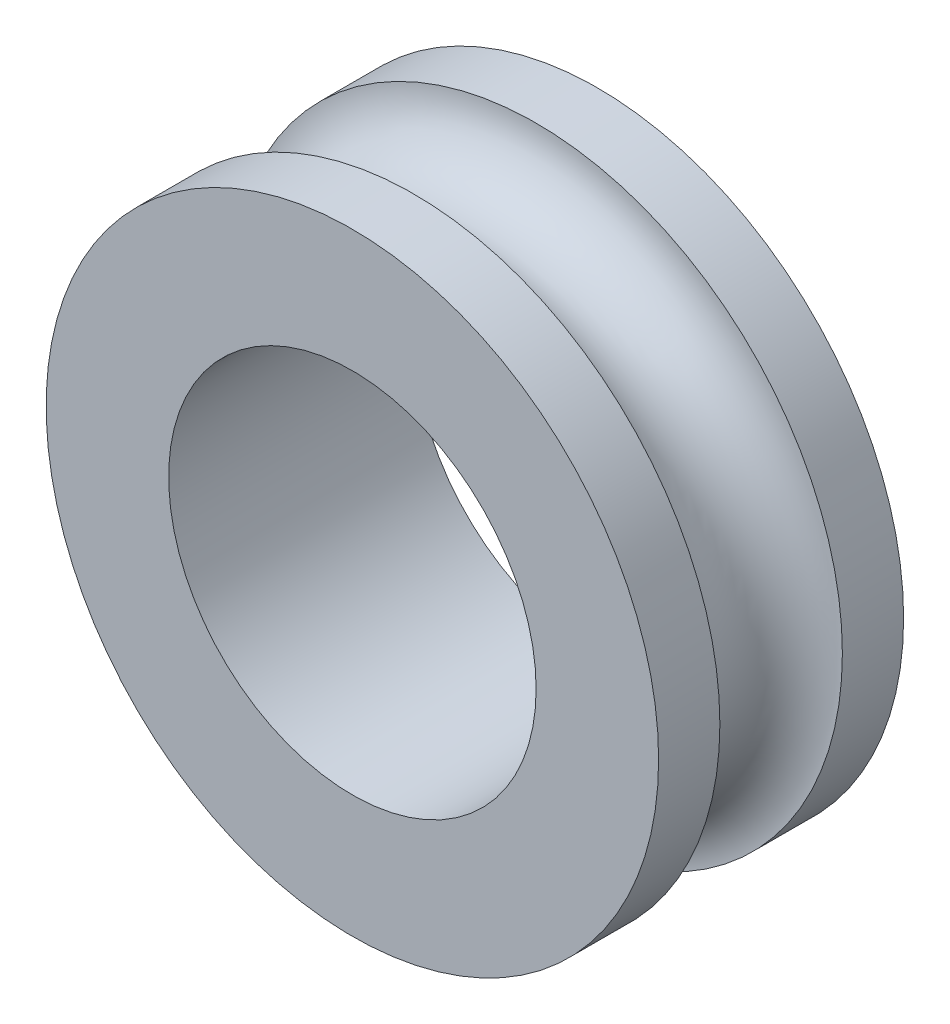
ISO-10303-21;
HEADER;
FILE_DESCRIPTION(('STEP AP214'),'2;1');
FILE_NAME('part.step','',(''),(''),'','','');
FILE_SCHEMA(('AUTOMOTIVE_DESIGN { 1 0 10303 214 1 1 1 1 }'));
ENDSEC;
DATA;
#1=APPLICATION_CONTEXT('core data for automotive mechanical design processes');
#2=APPLICATION_PROTOCOL_DEFINITION('international standard','automotive_design',2000,#1);
#3=PRODUCT_CONTEXT('',#1,'mechanical');
#4=PRODUCT('Part','Part','',(#3));
#5=PRODUCT_RELATED_PRODUCT_CATEGORY('part','',(#4));
#6=PRODUCT_DEFINITION_FORMATION('','',#4);
#7=PRODUCT_DEFINITION_CONTEXT('part definition',#1,'design');
#8=PRODUCT_DEFINITION('design','',#6,#7);
#9=PRODUCT_DEFINITION_SHAPE('','',#8);
#10=(LENGTH_UNIT() NAMED_UNIT(*) SI_UNIT(.MILLI.,.METRE.));
#11=(NAMED_UNIT(*) PLANE_ANGLE_UNIT() SI_UNIT($,.RADIAN.));
#12=(NAMED_UNIT(*) SI_UNIT($,.STERADIAN.) SOLID_ANGLE_UNIT());
#13=UNCERTAINTY_MEASURE_WITH_UNIT(LENGTH_MEASURE(1.E-05),#10,'distance_accuracy_value','');
#14=(GEOMETRIC_REPRESENTATION_CONTEXT(3) GLOBAL_UNCERTAINTY_ASSIGNED_CONTEXT((#13)) GLOBAL_UNIT_ASSIGNED_CONTEXT((#10,
#11,#12)) REPRESENTATION_CONTEXT('',''));
#15=CARTESIAN_POINT('',(0.,0.,0.));
#16=DIRECTION('',(0.,0.,1.));
#17=DIRECTION('',(1.,0.,0.));
#18=AXIS2_PLACEMENT_3D('',#15,#16,#17);
#19=CARTESIAN_POINT('',(0.,0.,4.));
#20=DIRECTION('',(0.,0.,-1.));
#21=DIRECTION('',(-1.,0.,0.));
#22=AXIS2_PLACEMENT_3D('',#19,#20,#21);
#23=CYLINDRICAL_SURFACE('',#22,5.);
#24=CARTESIAN_POINT('',(0.,0.,4.));
#25=DIRECTION('',(0.,0.,1.));
#26=DIRECTION('',(1.,0.,0.));
#27=AXIS2_PLACEMENT_3D('',#24,#25,#26);
#28=CIRCLE('',#27,5.);
#29=CARTESIAN_POINT('',(5.,0.,4.));
#30=VERTEX_POINT('',#29);
#31=EDGE_CURVE('E10',#30,#30,#28,.T.);
#32=ORIENTED_EDGE('',*,*,#31,.F.);
#33=EDGE_LOOP('',(#32));
#34=FACE_BOUND('',#33,.T.);
#35=CARTESIAN_POINT('',(0.,0.,3.));
#36=DIRECTION('',(0.,0.,1.));
#37=DIRECTION('',(1.,0.,0.));
#38=AXIS2_PLACEMENT_3D('',#35,#36,#37);
#39=CIRCLE('',#38,5.);
#40=CARTESIAN_POINT('',(5.,0.,3.));
#41=VERTEX_POINT('',#40);
#42=EDGE_CURVE('E53',#41,#41,#39,.T.);
#43=ORIENTED_EDGE('',*,*,#42,.T.);
#44=EDGE_LOOP('',(#43));
#45=FACE_BOUND('',#44,.T.);
#46=ADVANCED_FACE('F33',(#34,#45),#23,.T.);
#47=CARTESIAN_POINT('',(0.,0.,0.));
#48=DIRECTION('',(0.,0.,1.));
#49=DIRECTION('',(1.,0.,0.));
#50=AXIS2_PLACEMENT_3D('',#47,#48,#49);
#51=CIRCLE('',#50,5.);
#52=CARTESIAN_POINT('',(5.,0.,0.));
#53=VERTEX_POINT('',#52);
#54=EDGE_CURVE('E36',#53,#53,#51,.T.);
#55=ORIENTED_EDGE('',*,*,#54,.T.);
#56=EDGE_LOOP('',(#55));
#57=FACE_BOUND('',#56,.T.);
#58=CARTESIAN_POINT('',(0.,0.,1.));
#59=DIRECTION('',(0.,0.,1.));
#60=DIRECTION('',(1.,0.,0.));
#61=AXIS2_PLACEMENT_3D('',#58,#59,#60);
#62=CIRCLE('',#61,5.);
#63=CARTESIAN_POINT('',(5.,0.,1.));
#64=VERTEX_POINT('',#63);
#65=EDGE_CURVE('E48',#64,#64,#62,.T.);
#66=ORIENTED_EDGE('',*,*,#65,.F.);
#67=EDGE_LOOP('',(#66));
#68=FACE_BOUND('',#67,.T.);
#69=ADVANCED_FACE('F70',(#57,#68),#23,.T.);
#70=CARTESIAN_POINT('',(0.,0.,4.));
#71=DIRECTION('',(0.,0.,1.));
#72=DIRECTION('',(1.,0.,0.));
#73=AXIS2_PLACEMENT_3D('',#70,#71,#72);
#74=PLANE('',#73);
#75=ORIENTED_EDGE('',*,*,#31,.T.);
#76=EDGE_LOOP('',(#75));
#77=FACE_BOUND('',#76,.T.);
#78=CARTESIAN_POINT('',(0.,0.,4.));
#79=DIRECTION('',(0.,0.,1.));
#80=DIRECTION('',(1.,0.,0.));
#81=AXIS2_PLACEMENT_3D('',#78,#79,#80);
#82=CIRCLE('',#81,3.);
#83=CARTESIAN_POINT('',(3.,0.,4.));
#84=VERTEX_POINT('',#83);
#85=EDGE_CURVE('E43',#84,#84,#82,.T.);
#86=ORIENTED_EDGE('',*,*,#85,.F.);
#87=EDGE_LOOP('',(#86));
#88=FACE_BOUND('',#87,.T.);
#89=ADVANCED_FACE('F75',(#77,#88),#74,.T.);
#90=CARTESIAN_POINT('',(0.,0.,0.));
#91=DIRECTION('',(0.,0.,1.));
#92=DIRECTION('',(1.,0.,0.));
#93=AXIS2_PLACEMENT_3D('',#90,#91,#92);
#94=PLANE('',#93);
#95=ORIENTED_EDGE('',*,*,#54,.F.);
#96=EDGE_LOOP('',(#95));
#97=FACE_BOUND('',#96,.T.);
#98=CARTESIAN_POINT('',(0.,0.,0.));
#99=DIRECTION('',(0.,0.,1.));
#100=DIRECTION('',(1.,0.,0.));
#101=AXIS2_PLACEMENT_3D('',#98,#99,#100);
#102=CIRCLE('',#101,3.);
#103=CARTESIAN_POINT('',(3.,0.,0.));
#104=VERTEX_POINT('',#103);
#105=EDGE_CURVE('E45',#104,#104,#102,.T.);
#106=ORIENTED_EDGE('',*,*,#105,.T.);
#107=EDGE_LOOP('',(#106));
#108=FACE_BOUND('',#107,.T.);
#109=ADVANCED_FACE('F66',(#97,#108),#94,.F.);
#110=CARTESIAN_POINT('',(0.,0.,4.));
#111=DIRECTION('',(0.,0.,-1.));
#112=DIRECTION('',(-1.,0.,0.));
#113=AXIS2_PLACEMENT_3D('',#110,#111,#112);
#114=CYLINDRICAL_SURFACE('',#113,3.);
#115=ORIENTED_EDGE('',*,*,#85,.T.);
#116=EDGE_LOOP('',(#115));
#117=FACE_BOUND('',#116,.T.);
#118=ORIENTED_EDGE('',*,*,#105,.F.);
#119=EDGE_LOOP('',(#118));
#120=FACE_BOUND('',#119,.T.);
#121=ADVANCED_FACE('F60',(#117,#120),#114,.F.);
#122=CARTESIAN_POINT('',(0.,0.,2.));
#123=DIRECTION('',(0.,0.,1.));
#124=DIRECTION('',(1.,0.,0.));
#125=AXIS2_PLACEMENT_3D('',#122,#123,#124);
#126=TOROIDAL_SURFACE('',#125,5.,1.);
#127=ORIENTED_EDGE('',*,*,#65,.T.);
#128=EDGE_LOOP('',(#127));
#129=FACE_BOUND('',#128,.T.);
#130=ORIENTED_EDGE('',*,*,#42,.F.);
#131=EDGE_LOOP('',(#130));
#132=FACE_BOUND('',#131,.T.);
#133=ADVANCED_FACE('F58',(#129,#132),#126,.F.);
#134=CLOSED_SHELL('',(#46,#69,#89,#109,#121,#133));
#135=MANIFOLD_SOLID_BREP('B2',#134);
#136=ADVANCED_BREP_SHAPE_REPRESENTATION('',(#18,#135),#14);
#137=SHAPE_DEFINITION_REPRESENTATION(#9,#136);
ENDSEC;
END-ISO-10303-21;
